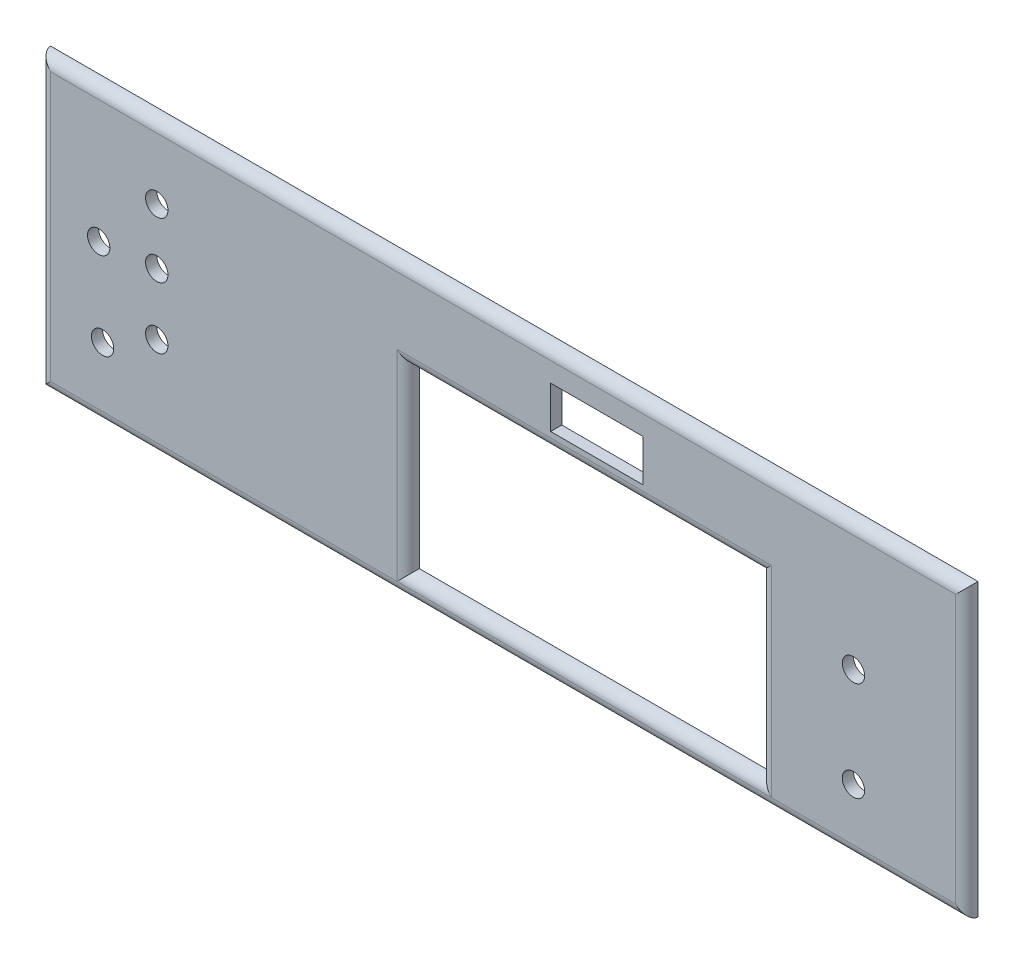
ISO-10303-21;
HEADER;
FILE_DESCRIPTION(('STEP AP214'),'2;1');
FILE_NAME('part.step','',(''),(''),'','','');
FILE_SCHEMA(('AUTOMOTIVE_DESIGN { 1 0 10303 214 1 1 1 1 }'));
ENDSEC;
DATA;
#1=APPLICATION_CONTEXT('core data for automotive mechanical design processes');
#2=APPLICATION_PROTOCOL_DEFINITION('international standard','automotive_design',2000,#1);
#3=PRODUCT_CONTEXT('',#1,'mechanical');
#4=PRODUCT('Part','Part','',(#3));
#5=PRODUCT_RELATED_PRODUCT_CATEGORY('part','',(#4));
#6=PRODUCT_DEFINITION_FORMATION('','',#4);
#7=PRODUCT_DEFINITION_CONTEXT('part definition',#1,'design');
#8=PRODUCT_DEFINITION('design','',#6,#7);
#9=PRODUCT_DEFINITION_SHAPE('','',#8);
#10=(LENGTH_UNIT() NAMED_UNIT(*) SI_UNIT(.MILLI.,.METRE.));
#11=(NAMED_UNIT(*) PLANE_ANGLE_UNIT() SI_UNIT($,.RADIAN.));
#12=(NAMED_UNIT(*) SI_UNIT($,.STERADIAN.) SOLID_ANGLE_UNIT());
#13=UNCERTAINTY_MEASURE_WITH_UNIT(LENGTH_MEASURE(1.E-05),#10,'distance_accuracy_value','');
#14=(GEOMETRIC_REPRESENTATION_CONTEXT(3) GLOBAL_UNCERTAINTY_ASSIGNED_CONTEXT((#13)) GLOBAL_UNIT_ASSIGNED_CONTEXT((#10,
#11,#12)) REPRESENTATION_CONTEXT('',''));
#15=CARTESIAN_POINT('',(0.,0.,0.));
#16=DIRECTION('',(0.,0.,1.));
#17=DIRECTION('',(1.,0.,0.));
#18=AXIS2_PLACEMENT_3D('',#15,#16,#17);
#19=CARTESIAN_POINT('',(0.,0.,2.));
#20=DIRECTION('',(0.,0.,-1.));
#21=DIRECTION('',(-1.,0.,0.));
#22=AXIS2_PLACEMENT_3D('',#19,#20,#21);
#23=PLANE('',#22);
#24=CARTESIAN_POINT('',(18.,15.,2.));
#25=DIRECTION('',(0.,0.,1.));
#26=DIRECTION('',(1.,0.,0.));
#27=AXIS2_PLACEMENT_3D('',#24,#25,#26);
#28=CIRCLE('',#27,2.);
#29=CARTESIAN_POINT('',(20.,15.,2.));
#30=VERTEX_POINT('',#29);
#31=EDGE_CURVE('E262',#30,#30,#28,.T.);
#32=ORIENTED_EDGE('',*,*,#31,.F.);
#33=EDGE_LOOP('',(#32));
#34=FACE_BOUND('',#33,.T.);
#35=CARTESIAN_POINT('',(18.,26.,2.));
#36=DIRECTION('',(0.,0.,1.));
#37=DIRECTION('',(1.,0.,0.));
#38=AXIS2_PLACEMENT_3D('',#35,#36,#37);
#39=CIRCLE('',#38,2.);
#40=CARTESIAN_POINT('',(20.,26.,2.));
#41=VERTEX_POINT('',#40);
#42=EDGE_CURVE('E253',#41,#41,#39,.T.);
#43=ORIENTED_EDGE('',*,*,#42,.F.);
#44=EDGE_LOOP('',(#43));
#45=FACE_BOUND('',#44,.T.);
#46=CARTESIAN_POINT('',(18.,36.,2.));
#47=DIRECTION('',(0.,0.,1.));
#48=DIRECTION('',(1.,0.,0.));
#49=AXIS2_PLACEMENT_3D('',#46,#47,#48);
#50=CIRCLE('',#49,2.);
#51=CARTESIAN_POINT('',(20.,36.,2.));
#52=VERTEX_POINT('',#51);
#53=EDGE_CURVE('E155',#52,#52,#50,.T.);
#54=ORIENTED_EDGE('',*,*,#53,.F.);
#55=EDGE_LOOP('',(#54));
#56=FACE_BOUND('',#55,.T.);
#57=DIRECTION('',(-1.,0.,0.));
#58=VECTOR('',#57,1.);
#59=CARTESIAN_POINT('',(0.,35.,2.));
#60=LINE('',#59,#58);
#61=CARTESIAN_POINT('',(61.,35.,2.));
#62=VERTEX_POINT('',#61);
#63=CARTESIAN_POINT('',(128.,35.,2.));
#64=VERTEX_POINT('',#63);
#65=EDGE_CURVE('E45',#62,#64,#60,.F.);
#66=ORIENTED_EDGE('',*,*,#65,.T.);
#67=DIRECTION('',(0.,1.,0.));
#68=VECTOR('',#67,1.);
#69=CARTESIAN_POINT('',(128.,0.,2.));
#70=LINE('',#69,#68);
#71=CARTESIAN_POINT('',(128.,-1.,2.));
#72=VERTEX_POINT('',#71);
#73=EDGE_CURVE('E11',#64,#72,#70,.F.);
#74=ORIENTED_EDGE('',*,*,#73,.T.);
#75=DIRECTION('',(-1.,0.,0.));
#76=VECTOR('',#75,1.);
#77=CARTESIAN_POINT('',(163.,-1.,2.));
#78=LINE('',#77,#76);
#79=CARTESIAN_POINT('',(161.,-1.,2.));
#80=VERTEX_POINT('',#79);
#81=EDGE_CURVE('E215',#72,#80,#78,.F.);
#82=ORIENTED_EDGE('',*,*,#81,.T.);
#83=DIRECTION('',(0.,-1.,0.));
#84=VECTOR('',#83,1.);
#85=CARTESIAN_POINT('',(161.,49.,2.));
#86=LINE('',#85,#84);
#87=CARTESIAN_POINT('',(161.,47.,2.));
#88=VERTEX_POINT('',#87);
#89=EDGE_CURVE('E211',#80,#88,#86,.F.);
#90=ORIENTED_EDGE('',*,*,#89,.T.);
#91=DIRECTION('',(1.,0.,0.));
#92=VECTOR('',#91,1.);
#93=CARTESIAN_POINT('',(-3.,47.,2.));
#94=LINE('',#93,#92);
#95=CARTESIAN_POINT('',(-1.,47.,2.));
#96=VERTEX_POINT('',#95);
#97=EDGE_CURVE('E218',#88,#96,#94,.F.);
#98=ORIENTED_EDGE('',*,*,#97,.T.);
#99=DIRECTION('',(0.,1.,0.));
#100=VECTOR('',#99,1.);
#101=CARTESIAN_POINT('',(-1.,-3.,2.));
#102=LINE('',#101,#100);
#103=CARTESIAN_POINT('',(-1.,-1.,2.));
#104=VERTEX_POINT('',#103);
#105=EDGE_CURVE('E221',#96,#104,#102,.F.);
#106=ORIENTED_EDGE('',*,*,#105,.T.);
#107=CARTESIAN_POINT('',(61.,-1.,2.));
#108=VERTEX_POINT('',#107);
#109=EDGE_CURVE('E216',#104,#108,#78,.F.);
#110=ORIENTED_EDGE('',*,*,#109,.T.);
#111=DIRECTION('',(0.,-1.,0.));
#112=VECTOR('',#111,1.);
#113=CARTESIAN_POINT('',(61.,0.,2.));
#114=LINE('',#113,#112);
#115=EDGE_CURVE('E56',#108,#62,#114,.F.);
#116=ORIENTED_EDGE('',*,*,#115,.T.);
#117=EDGE_LOOP('',(#66,#74,#82,#90,#98,#106,#110,#116));
#118=FACE_BOUND('',#117,.T.);
#119=DIRECTION('',(1.,0.,0.));
#120=VECTOR('',#119,1.);
#121=CARTESIAN_POINT('',(88.5,36.,2.));
#122=LINE('',#121,#120);
#123=CARTESIAN_POINT('',(88.5,36.,2.));
#124=VERTEX_POINT('',#123);
#125=CARTESIAN_POINT('',(105.,36.,2.));
#126=VERTEX_POINT('',#125);
#127=EDGE_CURVE('E161',#124,#126,#122,.T.);
#128=ORIENTED_EDGE('',*,*,#127,.F.);
#129=DIRECTION('',(0.,-1.,0.));
#130=VECTOR('',#129,1.);
#131=CARTESIAN_POINT('',(88.5,36.,2.));
#132=LINE('',#131,#130);
#133=CARTESIAN_POINT('',(88.5,43.5,2.));
#134=VERTEX_POINT('',#133);
#135=EDGE_CURVE('E131',#134,#124,#132,.T.);
#136=ORIENTED_EDGE('',*,*,#135,.F.);
#137=DIRECTION('',(-1.,0.,0.));
#138=VECTOR('',#137,1.);
#139=CARTESIAN_POINT('',(88.5,43.5,2.));
#140=LINE('',#139,#138);
#141=CARTESIAN_POINT('',(105.,43.5,2.));
#142=VERTEX_POINT('',#141);
#143=EDGE_CURVE('E149',#142,#134,#140,.T.);
#144=ORIENTED_EDGE('',*,*,#143,.F.);
#145=DIRECTION('',(0.,1.,0.));
#146=VECTOR('',#145,1.);
#147=CARTESIAN_POINT('',(105.,36.,2.));
#148=LINE('',#147,#146);
#149=EDGE_CURVE('E152',#126,#142,#148,.T.);
#150=ORIENTED_EDGE('',*,*,#149,.F.);
#151=EDGE_LOOP('',(#128,#136,#144,#150));
#152=FACE_BOUND('',#151,.T.);
#153=CARTESIAN_POINT('',(7.6,25.,2.));
#154=DIRECTION('',(0.,0.,1.));
#155=DIRECTION('',(1.,0.,0.));
#156=AXIS2_PLACEMENT_3D('',#153,#154,#155);
#157=CIRCLE('',#156,2.);
#158=CARTESIAN_POINT('',(9.6,25.,2.));
#159=VERTEX_POINT('',#158);
#160=EDGE_CURVE('E208',#159,#159,#157,.T.);
#161=ORIENTED_EDGE('',*,*,#160,.F.);
#162=EDGE_LOOP('',(#161));
#163=FACE_BOUND('',#162,.T.);
#164=CARTESIAN_POINT('',(8.3,9.7,2.));
#165=DIRECTION('',(0.,0.,1.));
#166=DIRECTION('',(1.,0.,0.));
#167=AXIS2_PLACEMENT_3D('',#164,#165,#166);
#168=CIRCLE('',#167,2.);
#169=CARTESIAN_POINT('',(10.3,9.7,2.));
#170=VERTEX_POINT('',#169);
#171=EDGE_CURVE('E202',#170,#170,#168,.T.);
#172=ORIENTED_EDGE('',*,*,#171,.F.);
#173=EDGE_LOOP('',(#172));
#174=FACE_BOUND('',#173,.T.);
#175=CARTESIAN_POINT('',(142.7,26.2,2.));
#176=DIRECTION('',(0.,0.,1.));
#177=DIRECTION('',(1.,0.,0.));
#178=AXIS2_PLACEMENT_3D('',#175,#176,#177);
#179=CIRCLE('',#178,2.);
#180=CARTESIAN_POINT('',(144.7,26.2,2.));
#181=VERTEX_POINT('',#180);
#182=EDGE_CURVE('E196',#181,#181,#179,.T.);
#183=ORIENTED_EDGE('',*,*,#182,.F.);
#184=EDGE_LOOP('',(#183));
#185=FACE_BOUND('',#184,.T.);
#186=CARTESIAN_POINT('',(142.7,8.4,2.));
#187=DIRECTION('',(0.,0.,1.));
#188=DIRECTION('',(1.,0.,0.));
#189=AXIS2_PLACEMENT_3D('',#186,#187,#188);
#190=CIRCLE('',#189,2.);
#191=CARTESIAN_POINT('',(144.7,8.4,2.));
#192=VERTEX_POINT('',#191);
#193=EDGE_CURVE('E190',#192,#192,#190,.T.);
#194=ORIENTED_EDGE('',*,*,#193,.F.);
#195=EDGE_LOOP('',(#194));
#196=FACE_BOUND('',#195,.T.);
#197=ADVANCED_FACE('F36',(#34,#45,#56,#118,#152,#163,#174,#185,#196),#23,.F.);
#198=CARTESIAN_POINT('',(0.,0.,0.));
#199=DIRECTION('',(0.,0.,-1.));
#200=DIRECTION('',(-1.,0.,0.));
#201=AXIS2_PLACEMENT_3D('',#198,#199,#200);
#202=PLANE('',#201);
#203=CARTESIAN_POINT('',(18.,15.,0.));
#204=DIRECTION('',(0.,0.,1.));
#205=DIRECTION('',(1.,0.,0.));
#206=AXIS2_PLACEMENT_3D('',#203,#204,#205);
#207=CIRCLE('',#206,2.);
#208=CARTESIAN_POINT('',(20.,15.,0.));
#209=VERTEX_POINT('',#208);
#210=EDGE_CURVE('E227',#209,#209,#207,.T.);
#211=ORIENTED_EDGE('',*,*,#210,.T.);
#212=EDGE_LOOP('',(#211));
#213=FACE_BOUND('',#212,.T.);
#214=CARTESIAN_POINT('',(18.,26.,0.));
#215=DIRECTION('',(0.,0.,1.));
#216=DIRECTION('',(1.,0.,0.));
#217=AXIS2_PLACEMENT_3D('',#214,#215,#216);
#218=CIRCLE('',#217,2.);
#219=CARTESIAN_POINT('',(20.,26.,0.));
#220=VERTEX_POINT('',#219);
#221=EDGE_CURVE('E257',#220,#220,#218,.T.);
#222=ORIENTED_EDGE('',*,*,#221,.T.);
#223=EDGE_LOOP('',(#222));
#224=FACE_BOUND('',#223,.T.);
#225=CARTESIAN_POINT('',(18.,36.,0.));
#226=DIRECTION('',(0.,0.,1.));
#227=DIRECTION('',(1.,0.,0.));
#228=AXIS2_PLACEMENT_3D('',#225,#226,#227);
#229=CIRCLE('',#228,2.);
#230=CARTESIAN_POINT('',(20.,36.,0.));
#231=VERTEX_POINT('',#230);
#232=EDGE_CURVE('E249',#231,#231,#229,.T.);
#233=ORIENTED_EDGE('',*,*,#232,.T.);
#234=EDGE_LOOP('',(#233));
#235=FACE_BOUND('',#234,.T.);
#236=DIRECTION('',(0.,-1.,0.));
#237=VECTOR('',#236,1.);
#238=CARTESIAN_POINT('',(88.5,36.,0.));
#239=LINE('',#238,#237);
#240=CARTESIAN_POINT('',(88.5,43.5,0.));
#241=VERTEX_POINT('',#240);
#242=CARTESIAN_POINT('',(88.5,36.,0.));
#243=VERTEX_POINT('',#242);
#244=EDGE_CURVE('E128',#241,#243,#239,.T.);
#245=ORIENTED_EDGE('',*,*,#244,.T.);
#246=DIRECTION('',(1.,0.,0.));
#247=VECTOR('',#246,1.);
#248=CARTESIAN_POINT('',(88.5,36.,0.));
#249=LINE('',#248,#247);
#250=CARTESIAN_POINT('',(105.,36.,0.));
#251=VERTEX_POINT('',#250);
#252=EDGE_CURVE('E140',#243,#251,#249,.T.);
#253=ORIENTED_EDGE('',*,*,#252,.T.);
#254=DIRECTION('',(0.,1.,0.));
#255=VECTOR('',#254,1.);
#256=CARTESIAN_POINT('',(105.,36.,0.));
#257=LINE('',#256,#255);
#258=CARTESIAN_POINT('',(105.,43.5,0.));
#259=VERTEX_POINT('',#258);
#260=EDGE_CURVE('E144',#251,#259,#257,.T.);
#261=ORIENTED_EDGE('',*,*,#260,.T.);
#262=DIRECTION('',(-1.,0.,0.));
#263=VECTOR('',#262,1.);
#264=CARTESIAN_POINT('',(88.5,43.5,0.));
#265=LINE('',#264,#263);
#266=EDGE_CURVE('E136',#259,#241,#265,.T.);
#267=ORIENTED_EDGE('',*,*,#266,.T.);
#268=EDGE_LOOP('',(#245,#253,#261,#267));
#269=FACE_BOUND('',#268,.T.);
#270=DIRECTION('',(0.,-1.,0.));
#271=VECTOR('',#270,1.);
#272=CARTESIAN_POINT('',(63.,33.,0.));
#273=LINE('',#272,#271);
#274=CARTESIAN_POINT('',(63.,33.,0.));
#275=VERTEX_POINT('',#274);
#276=CARTESIAN_POINT('',(63.,1.,0.));
#277=VERTEX_POINT('',#276);
#278=EDGE_CURVE('E168',#275,#277,#273,.T.);
#279=ORIENTED_EDGE('',*,*,#278,.T.);
#280=DIRECTION('',(1.,0.,0.));
#281=VECTOR('',#280,1.);
#282=CARTESIAN_POINT('',(63.,1.,0.));
#283=LINE('',#282,#281);
#284=CARTESIAN_POINT('',(126.,1.,0.));
#285=VERTEX_POINT('',#284);
#286=EDGE_CURVE('E173',#277,#285,#283,.T.);
#287=ORIENTED_EDGE('',*,*,#286,.T.);
#288=DIRECTION('',(0.,1.,0.));
#289=VECTOR('',#288,1.);
#290=CARTESIAN_POINT('',(126.,33.,0.));
#291=LINE('',#290,#289);
#292=CARTESIAN_POINT('',(126.,33.,0.));
#293=VERTEX_POINT('',#292);
#294=EDGE_CURVE('E176',#285,#293,#291,.T.);
#295=ORIENTED_EDGE('',*,*,#294,.T.);
#296=DIRECTION('',(-1.,0.,0.));
#297=VECTOR('',#296,1.);
#298=CARTESIAN_POINT('',(63.,33.,0.));
#299=LINE('',#298,#297);
#300=EDGE_CURVE('E178',#293,#275,#299,.T.);
#301=ORIENTED_EDGE('',*,*,#300,.T.);
#302=EDGE_LOOP('',(#279,#287,#295,#301));
#303=FACE_BOUND('',#302,.T.);
#304=CARTESIAN_POINT('',(142.7,26.2,0.));
#305=DIRECTION('',(0.,0.,1.));
#306=DIRECTION('',(1.,0.,0.));
#307=AXIS2_PLACEMENT_3D('',#304,#305,#306);
#308=CIRCLE('',#307,2.);
#309=CARTESIAN_POINT('',(144.7,26.2,0.));
#310=VERTEX_POINT('',#309);
#311=EDGE_CURVE('E193',#310,#310,#308,.T.);
#312=ORIENTED_EDGE('',*,*,#311,.T.);
#313=EDGE_LOOP('',(#312));
#314=FACE_BOUND('',#313,.T.);
#315=CARTESIAN_POINT('',(7.6,25.,0.));
#316=DIRECTION('',(0.,0.,1.));
#317=DIRECTION('',(1.,0.,0.));
#318=AXIS2_PLACEMENT_3D('',#315,#316,#317);
#319=CIRCLE('',#318,2.);
#320=CARTESIAN_POINT('',(9.6,25.,0.));
#321=VERTEX_POINT('',#320);
#322=EDGE_CURVE('E205',#321,#321,#319,.T.);
#323=ORIENTED_EDGE('',*,*,#322,.T.);
#324=EDGE_LOOP('',(#323));
#325=FACE_BOUND('',#324,.T.);
#326=CARTESIAN_POINT('',(8.3,9.7,0.));
#327=DIRECTION('',(0.,0.,1.));
#328=DIRECTION('',(1.,0.,0.));
#329=AXIS2_PLACEMENT_3D('',#326,#327,#328);
#330=CIRCLE('',#329,2.);
#331=CARTESIAN_POINT('',(10.3,9.7,0.));
#332=VERTEX_POINT('',#331);
#333=EDGE_CURVE('E199',#332,#332,#330,.T.);
#334=ORIENTED_EDGE('',*,*,#333,.T.);
#335=EDGE_LOOP('',(#334));
#336=FACE_BOUND('',#335,.T.);
#337=CARTESIAN_POINT('',(142.7,8.4,0.));
#338=DIRECTION('',(0.,0.,1.));
#339=DIRECTION('',(1.,0.,0.));
#340=AXIS2_PLACEMENT_3D('',#337,#338,#339);
#341=CIRCLE('',#340,2.);
#342=CARTESIAN_POINT('',(144.7,8.4,0.));
#343=VERTEX_POINT('',#342);
#344=EDGE_CURVE('E189',#343,#343,#341,.T.);
#345=ORIENTED_EDGE('',*,*,#344,.T.);
#346=EDGE_LOOP('',(#345));
#347=FACE_BOUND('',#346,.T.);
#348=DIRECTION('',(-1.,0.,0.));
#349=VECTOR('',#348,1.);
#350=CARTESIAN_POINT('',(163.,-3.,0.));
#351=LINE('',#350,#349);
#352=CARTESIAN_POINT('',(163.,-3.,0.));
#353=VERTEX_POINT('',#352);
#354=CARTESIAN_POINT('',(-3.,-3.,0.));
#355=VERTEX_POINT('',#354);
#356=EDGE_CURVE('E180',#353,#355,#351,.T.);
#357=ORIENTED_EDGE('',*,*,#356,.T.);
#358=DIRECTION('',(0.,1.,0.));
#359=VECTOR('',#358,1.);
#360=CARTESIAN_POINT('',(-3.,-3.,0.));
#361=LINE('',#360,#359);
#362=CARTESIAN_POINT('',(-3.,49.,0.));
#363=VERTEX_POINT('',#362);
#364=EDGE_CURVE('E182',#355,#363,#361,.T.);
#365=ORIENTED_EDGE('',*,*,#364,.T.);
#366=DIRECTION('',(1.,0.,0.));
#367=VECTOR('',#366,1.);
#368=CARTESIAN_POINT('',(-3.,49.,0.));
#369=LINE('',#368,#367);
#370=CARTESIAN_POINT('',(163.,49.,0.));
#371=VERTEX_POINT('',#370);
#372=EDGE_CURVE('E185',#363,#371,#369,.T.);
#373=ORIENTED_EDGE('',*,*,#372,.T.);
#374=DIRECTION('',(0.,-1.,0.));
#375=VECTOR('',#374,1.);
#376=CARTESIAN_POINT('',(163.,49.,0.));
#377=LINE('',#376,#375);
#378=EDGE_CURVE('E187',#371,#353,#377,.T.);
#379=ORIENTED_EDGE('',*,*,#378,.T.);
#380=EDGE_LOOP('',(#357,#365,#373,#379));
#381=FACE_BOUND('',#380,.T.);
#382=ADVANCED_FACE('F146',(#213,#224,#235,#269,#303,#314,#325,#336,#347,#381),#202,.T.);
#383=CARTESIAN_POINT('',(7.6,25.,2.));
#384=DIRECTION('',(0.,0.,-1.));
#385=DIRECTION('',(-1.,0.,0.));
#386=AXIS2_PLACEMENT_3D('',#383,#384,#385);
#387=CYLINDRICAL_SURFACE('',#386,2.);
#388=ORIENTED_EDGE('',*,*,#160,.T.);
#389=EDGE_LOOP('',(#388));
#390=FACE_BOUND('',#389,.T.);
#391=ORIENTED_EDGE('',*,*,#322,.F.);
#392=EDGE_LOOP('',(#391));
#393=FACE_BOUND('',#392,.T.);
#394=ADVANCED_FACE('F302',(#390,#393),#387,.F.);
#395=CARTESIAN_POINT('',(8.3,9.7,2.));
#396=DIRECTION('',(0.,0.,-1.));
#397=DIRECTION('',(-1.,0.,0.));
#398=AXIS2_PLACEMENT_3D('',#395,#396,#397);
#399=CYLINDRICAL_SURFACE('',#398,2.);
#400=ORIENTED_EDGE('',*,*,#171,.T.);
#401=EDGE_LOOP('',(#400));
#402=FACE_BOUND('',#401,.T.);
#403=ORIENTED_EDGE('',*,*,#333,.F.);
#404=EDGE_LOOP('',(#403));
#405=FACE_BOUND('',#404,.T.);
#406=ADVANCED_FACE('F357',(#402,#405),#399,.F.);
#407=CARTESIAN_POINT('',(142.7,26.2,2.));
#408=DIRECTION('',(0.,0.,-1.));
#409=DIRECTION('',(-1.,0.,0.));
#410=AXIS2_PLACEMENT_3D('',#407,#408,#409);
#411=CYLINDRICAL_SURFACE('',#410,2.);
#412=ORIENTED_EDGE('',*,*,#182,.T.);
#413=EDGE_LOOP('',(#412));
#414=FACE_BOUND('',#413,.T.);
#415=ORIENTED_EDGE('',*,*,#311,.F.);
#416=EDGE_LOOP('',(#415));
#417=FACE_BOUND('',#416,.T.);
#418=ADVANCED_FACE('F296',(#414,#417),#411,.F.);
#419=CARTESIAN_POINT('',(142.7,8.4,2.));
#420=DIRECTION('',(0.,0.,-1.));
#421=DIRECTION('',(-1.,0.,0.));
#422=AXIS2_PLACEMENT_3D('',#419,#420,#421);
#423=CYLINDRICAL_SURFACE('',#422,2.);
#424=ORIENTED_EDGE('',*,*,#193,.T.);
#425=EDGE_LOOP('',(#424));
#426=FACE_BOUND('',#425,.T.);
#427=ORIENTED_EDGE('',*,*,#344,.F.);
#428=EDGE_LOOP('',(#427));
#429=FACE_BOUND('',#428,.T.);
#430=ADVANCED_FACE('F293',(#426,#429),#423,.F.);
#431=CARTESIAN_POINT('',(88.5,36.,0.));
#432=DIRECTION('',(-1.,0.,0.));
#433=DIRECTION('',(0.,0.,1.));
#434=AXIS2_PLACEMENT_3D('',#431,#432,#433);
#435=PLANE('',#434);
#436=ORIENTED_EDGE('',*,*,#135,.T.);
#437=DIRECTION('',(0.,0.,1.));
#438=VECTOR('',#437,1.);
#439=CARTESIAN_POINT('',(88.5,36.,0.));
#440=LINE('',#439,#438);
#441=EDGE_CURVE('E124',#243,#124,#440,.T.);
#442=ORIENTED_EDGE('',*,*,#441,.F.);
#443=ORIENTED_EDGE('',*,*,#244,.F.);
#444=DIRECTION('',(0.,0.,1.));
#445=VECTOR('',#444,1.);
#446=CARTESIAN_POINT('',(88.5,43.5,0.));
#447=LINE('',#446,#445);
#448=EDGE_CURVE('E166',#241,#134,#447,.T.);
#449=ORIENTED_EDGE('',*,*,#448,.T.);
#450=EDGE_LOOP('',(#436,#442,#443,#449));
#451=FACE_BOUND('',#450,.T.);
#452=ADVANCED_FACE('F126',(#451),#435,.F.);
#453=CARTESIAN_POINT('',(88.5,43.5,0.));
#454=DIRECTION('',(0.,1.,0.));
#455=DIRECTION('',(0.,0.,1.));
#456=AXIS2_PLACEMENT_3D('',#453,#454,#455);
#457=PLANE('',#456);
#458=ORIENTED_EDGE('',*,*,#143,.T.);
#459=ORIENTED_EDGE('',*,*,#448,.F.);
#460=ORIENTED_EDGE('',*,*,#266,.F.);
#461=DIRECTION('',(0.,0.,1.));
#462=VECTOR('',#461,1.);
#463=CARTESIAN_POINT('',(105.,43.5,0.));
#464=LINE('',#463,#462);
#465=EDGE_CURVE('E169',#259,#142,#464,.T.);
#466=ORIENTED_EDGE('',*,*,#465,.T.);
#467=EDGE_LOOP('',(#458,#459,#460,#466));
#468=FACE_BOUND('',#467,.T.);
#469=ADVANCED_FACE('F367',(#468),#457,.F.);
#470=CARTESIAN_POINT('',(105.,36.,0.));
#471=DIRECTION('',(1.,0.,0.));
#472=DIRECTION('',(0.,0.,-1.));
#473=AXIS2_PLACEMENT_3D('',#470,#471,#472);
#474=PLANE('',#473);
#475=ORIENTED_EDGE('',*,*,#149,.T.);
#476=ORIENTED_EDGE('',*,*,#465,.F.);
#477=ORIENTED_EDGE('',*,*,#260,.F.);
#478=DIRECTION('',(0.,0.,1.));
#479=VECTOR('',#478,1.);
#480=CARTESIAN_POINT('',(105.,36.,0.));
#481=LINE('',#480,#479);
#482=EDGE_CURVE('E135',#251,#126,#481,.T.);
#483=ORIENTED_EDGE('',*,*,#482,.T.);
#484=EDGE_LOOP('',(#475,#476,#477,#483));
#485=FACE_BOUND('',#484,.T.);
#486=ADVANCED_FACE('F370',(#485),#474,.F.);
#487=CARTESIAN_POINT('',(88.5,36.,0.));
#488=DIRECTION('',(0.,-1.,0.));
#489=DIRECTION('',(0.,0.,-1.));
#490=AXIS2_PLACEMENT_3D('',#487,#488,#489);
#491=PLANE('',#490);
#492=ORIENTED_EDGE('',*,*,#127,.T.);
#493=ORIENTED_EDGE('',*,*,#482,.F.);
#494=ORIENTED_EDGE('',*,*,#252,.F.);
#495=ORIENTED_EDGE('',*,*,#441,.T.);
#496=EDGE_LOOP('',(#492,#493,#494,#495));
#497=FACE_BOUND('',#496,.T.);
#498=ADVANCED_FACE('F141',(#497),#491,.F.);
#499=CARTESIAN_POINT('',(161.,49.,0.));
#500=DIRECTION('',(0.,1.,0.));
#501=DIRECTION('',(0.,0.,1.));
#502=AXIS2_PLACEMENT_3D('',#499,#500,#501);
#503=CYLINDRICAL_SURFACE('',#502,2.);
#504=CARTESIAN_POINT('',(161.,47.,0.));
#505=DIRECTION('',(-0.707106781186547,0.707106781186547,0.));
#506=DIRECTION('',(0.707106781186547,0.707106781186547,0.));
#507=AXIS2_PLACEMENT_3D('',#504,#505,#506);
#508=ELLIPSE('',#507,2.82842712474619,2.);
#509=EDGE_CURVE('E229',#88,#371,#508,.T.);
#510=ORIENTED_EDGE('',*,*,#509,.F.);
#511=ORIENTED_EDGE('',*,*,#89,.F.);
#512=CARTESIAN_POINT('',(161.,-1.,0.));
#513=DIRECTION('',(0.707106781186547,0.707106781186547,0.));
#514=DIRECTION('',(-0.707106781186547,0.707106781186547,0.));
#515=AXIS2_PLACEMENT_3D('',#512,#513,#514);
#516=ELLIPSE('',#515,2.82842712474619,2.);
#517=EDGE_CURVE('E162',#353,#80,#516,.F.);
#518=ORIENTED_EDGE('',*,*,#517,.F.);
#519=ORIENTED_EDGE('',*,*,#378,.F.);
#520=EDGE_LOOP('',(#510,#511,#518,#519));
#521=FACE_BOUND('',#520,.T.);
#522=ADVANCED_FACE('F323',(#521),#503,.T.);
#523=CARTESIAN_POINT('',(163.,-1.,0.));
#524=DIRECTION('',(1.,0.,0.));
#525=DIRECTION('',(0.,0.,-1.));
#526=AXIS2_PLACEMENT_3D('',#523,#524,#525);
#527=CYLINDRICAL_SURFACE('',#526,2.);
#528=ORIENTED_EDGE('',*,*,#517,.T.);
#529=ORIENTED_EDGE('',*,*,#81,.F.);
#530=EDGE_CURVE('E219',#108,#72,#78,.F.);
#531=ORIENTED_EDGE('',*,*,#530,.F.);
#532=ORIENTED_EDGE('',*,*,#109,.F.);
#533=CARTESIAN_POINT('',(-1.,-1.,0.));
#534=DIRECTION('',(0.707106781186547,-0.707106781186547,0.));
#535=DIRECTION('',(0.707106781186547,0.707106781186547,0.));
#536=AXIS2_PLACEMENT_3D('',#533,#534,#535);
#537=ELLIPSE('',#536,2.82842712474619,2.);
#538=EDGE_CURVE('E226',#355,#104,#537,.F.);
#539=ORIENTED_EDGE('',*,*,#538,.F.);
#540=ORIENTED_EDGE('',*,*,#356,.F.);
#541=EDGE_LOOP('',(#528,#529,#531,#532,#539,#540));
#542=FACE_BOUND('',#541,.T.);
#543=ADVANCED_FACE('F311',(#542),#527,.T.);
#544=CARTESIAN_POINT('',(-3.,47.,0.));
#545=DIRECTION('',(-1.,0.,0.));
#546=DIRECTION('',(0.,0.,1.));
#547=AXIS2_PLACEMENT_3D('',#544,#545,#546);
#548=CYLINDRICAL_SURFACE('',#547,2.);
#549=ORIENTED_EDGE('',*,*,#509,.T.);
#550=ORIENTED_EDGE('',*,*,#372,.F.);
#551=CARTESIAN_POINT('',(-1.,47.,0.));
#552=DIRECTION('',(-0.707106781186547,-0.707106781186547,0.));
#553=DIRECTION('',(-0.707106781186547,0.707106781186547,0.));
#554=AXIS2_PLACEMENT_3D('',#551,#552,#553);
#555=ELLIPSE('',#554,2.82842712474619,2.);
#556=EDGE_CURVE('E224',#96,#363,#555,.T.);
#557=ORIENTED_EDGE('',*,*,#556,.F.);
#558=ORIENTED_EDGE('',*,*,#97,.F.);
#559=EDGE_LOOP('',(#549,#550,#557,#558));
#560=FACE_BOUND('',#559,.T.);
#561=ADVANCED_FACE('F320',(#560),#548,.T.);
#562=CARTESIAN_POINT('',(-1.,-3.,0.));
#563=DIRECTION('',(0.,-1.,0.));
#564=DIRECTION('',(0.,0.,-1.));
#565=AXIS2_PLACEMENT_3D('',#562,#563,#564);
#566=CYLINDRICAL_SURFACE('',#565,2.);
#567=ORIENTED_EDGE('',*,*,#538,.T.);
#568=ORIENTED_EDGE('',*,*,#105,.F.);
#569=ORIENTED_EDGE('',*,*,#556,.T.);
#570=ORIENTED_EDGE('',*,*,#364,.F.);
#571=EDGE_LOOP('',(#567,#568,#569,#570));
#572=FACE_BOUND('',#571,.T.);
#573=ADVANCED_FACE('F315',(#572),#566,.T.);
#574=CARTESIAN_POINT('',(18.,36.,0.));
#575=DIRECTION('',(0.,0.,1.));
#576=DIRECTION('',(1.,0.,0.));
#577=AXIS2_PLACEMENT_3D('',#574,#575,#576);
#578=CYLINDRICAL_SURFACE('',#577,2.);
#579=ORIENTED_EDGE('',*,*,#232,.F.);
#580=EDGE_LOOP('',(#579));
#581=FACE_BOUND('',#580,.T.);
#582=ORIENTED_EDGE('',*,*,#53,.T.);
#583=EDGE_LOOP('',(#582));
#584=FACE_BOUND('',#583,.T.);
#585=ADVANCED_FACE('F353',(#581,#584),#578,.F.);
#586=CARTESIAN_POINT('',(18.,26.,0.));
#587=DIRECTION('',(0.,0.,1.));
#588=DIRECTION('',(1.,0.,0.));
#589=AXIS2_PLACEMENT_3D('',#586,#587,#588);
#590=CYLINDRICAL_SURFACE('',#589,2.);
#591=ORIENTED_EDGE('',*,*,#221,.F.);
#592=EDGE_LOOP('',(#591));
#593=FACE_BOUND('',#592,.T.);
#594=ORIENTED_EDGE('',*,*,#42,.T.);
#595=EDGE_LOOP('',(#594));
#596=FACE_BOUND('',#595,.T.);
#597=ADVANCED_FACE('F273',(#593,#596),#590,.F.);
#598=CARTESIAN_POINT('',(18.,15.,0.));
#599=DIRECTION('',(0.,0.,1.));
#600=DIRECTION('',(1.,0.,0.));
#601=AXIS2_PLACEMENT_3D('',#598,#599,#600);
#602=CYLINDRICAL_SURFACE('',#601,2.);
#603=ORIENTED_EDGE('',*,*,#210,.F.);
#604=EDGE_LOOP('',(#603));
#605=FACE_BOUND('',#604,.T.);
#606=ORIENTED_EDGE('',*,*,#31,.T.);
#607=EDGE_LOOP('',(#606));
#608=FACE_BOUND('',#607,.T.);
#609=ADVANCED_FACE('F270',(#605,#608),#602,.F.);
#610=CARTESIAN_POINT('',(63.,35.,0.));
#611=DIRECTION('',(-1.,0.,0.));
#612=DIRECTION('',(0.,0.,1.));
#613=AXIS2_PLACEMENT_3D('',#610,#611,#612);
#614=CYLINDRICAL_SURFACE('',#613,2.);
#615=CARTESIAN_POINT('',(128.,35.,0.));
#616=DIRECTION('',(-0.707106781186547,0.707106781186547,0.));
#617=DIRECTION('',(0.707106781186547,0.707106781186547,0.));
#618=AXIS2_PLACEMENT_3D('',#615,#616,#617);
#619=ELLIPSE('',#618,2.82842712474619,2.);
#620=EDGE_CURVE('E239',#64,#293,#619,.F.);
#621=ORIENTED_EDGE('',*,*,#620,.F.);
#622=ORIENTED_EDGE('',*,*,#65,.F.);
#623=CARTESIAN_POINT('',(61.,35.,0.));
#624=DIRECTION('',(-0.707106781186547,-0.707106781186548,0.));
#625=DIRECTION('',(-0.707106781186548,0.707106781186547,0.));
#626=AXIS2_PLACEMENT_3D('',#623,#624,#625);
#627=ELLIPSE('',#626,2.82842712474619,2.);
#628=EDGE_CURVE('E40',#275,#62,#627,.T.);
#629=ORIENTED_EDGE('',*,*,#628,.F.);
#630=ORIENTED_EDGE('',*,*,#300,.F.);
#631=EDGE_LOOP('',(#621,#622,#629,#630));
#632=FACE_BOUND('',#631,.T.);
#633=ADVANCED_FACE('F38',(#632),#614,.T.);
#634=CARTESIAN_POINT('',(61.,33.,0.));
#635=DIRECTION('',(0.,-1.,0.));
#636=DIRECTION('',(1.,0.,0.));
#637=AXIS2_PLACEMENT_3D('',#634,#635,#636);
#638=CYLINDRICAL_SURFACE('',#637,2.);
#639=ORIENTED_EDGE('',*,*,#628,.T.);
#640=ORIENTED_EDGE('',*,*,#115,.F.);
#641=CARTESIAN_POINT('',(61.,-1.,0.));
#642=DIRECTION('',(0.707106781186548,-0.707106781186547,0.));
#643=DIRECTION('',(0.707106781186547,0.707106781186548,0.));
#644=AXIS2_PLACEMENT_3D('',#641,#642,#643);
#645=ELLIPSE('',#644,2.82842712474619,2.);
#646=EDGE_CURVE('E238',#277,#108,#645,.T.);
#647=ORIENTED_EDGE('',*,*,#646,.F.);
#648=ORIENTED_EDGE('',*,*,#278,.F.);
#649=EDGE_LOOP('',(#639,#640,#647,#648));
#650=FACE_BOUND('',#649,.T.);
#651=ADVANCED_FACE('F335',(#650),#638,.T.);
#652=CARTESIAN_POINT('',(128.,33.,0.));
#653=DIRECTION('',(0.,1.,0.));
#654=DIRECTION('',(0.,0.,1.));
#655=AXIS2_PLACEMENT_3D('',#652,#653,#654);
#656=CYLINDRICAL_SURFACE('',#655,2.);
#657=ORIENTED_EDGE('',*,*,#620,.T.);
#658=ORIENTED_EDGE('',*,*,#294,.F.);
#659=CARTESIAN_POINT('',(128.,-1.,0.));
#660=DIRECTION('',(0.707106781186547,0.707106781186547,0.));
#661=DIRECTION('',(0.707106781186547,-0.707106781186547,0.));
#662=AXIS2_PLACEMENT_3D('',#659,#660,#661);
#663=ELLIPSE('',#662,2.82842712474619,2.);
#664=EDGE_CURVE('E236',#72,#285,#663,.F.);
#665=ORIENTED_EDGE('',*,*,#664,.F.);
#666=ORIENTED_EDGE('',*,*,#73,.F.);
#667=EDGE_LOOP('',(#657,#658,#665,#666));
#668=FACE_BOUND('',#667,.T.);
#669=ADVANCED_FACE('F332',(#668),#656,.T.);
#670=CARTESIAN_POINT('',(63.,-1.,0.));
#671=DIRECTION('',(1.,0.,0.));
#672=DIRECTION('',(0.,0.,-1.));
#673=AXIS2_PLACEMENT_3D('',#670,#671,#672);
#674=CYLINDRICAL_SURFACE('',#673,2.);
#675=ORIENTED_EDGE('',*,*,#646,.T.);
#676=ORIENTED_EDGE('',*,*,#530,.T.);
#677=ORIENTED_EDGE('',*,*,#664,.T.);
#678=ORIENTED_EDGE('',*,*,#286,.F.);
#679=EDGE_LOOP('',(#675,#676,#677,#678));
#680=FACE_BOUND('',#679,.T.);
#681=ADVANCED_FACE('F329',(#680),#674,.T.);
#682=CLOSED_SHELL('',(#197,#382,#394,#406,#418,#430,#452,#469,#486,#498,#522,#543,#561,#573,
#585,#597,#609,#633,#651,#669,#681));
#683=MANIFOLD_SOLID_BREP('B2',#682);
#684=ADVANCED_BREP_SHAPE_REPRESENTATION('',(#18,#683),#14);
#685=SHAPE_DEFINITION_REPRESENTATION(#9,#684);
ENDSEC;
END-ISO-10303-21;
